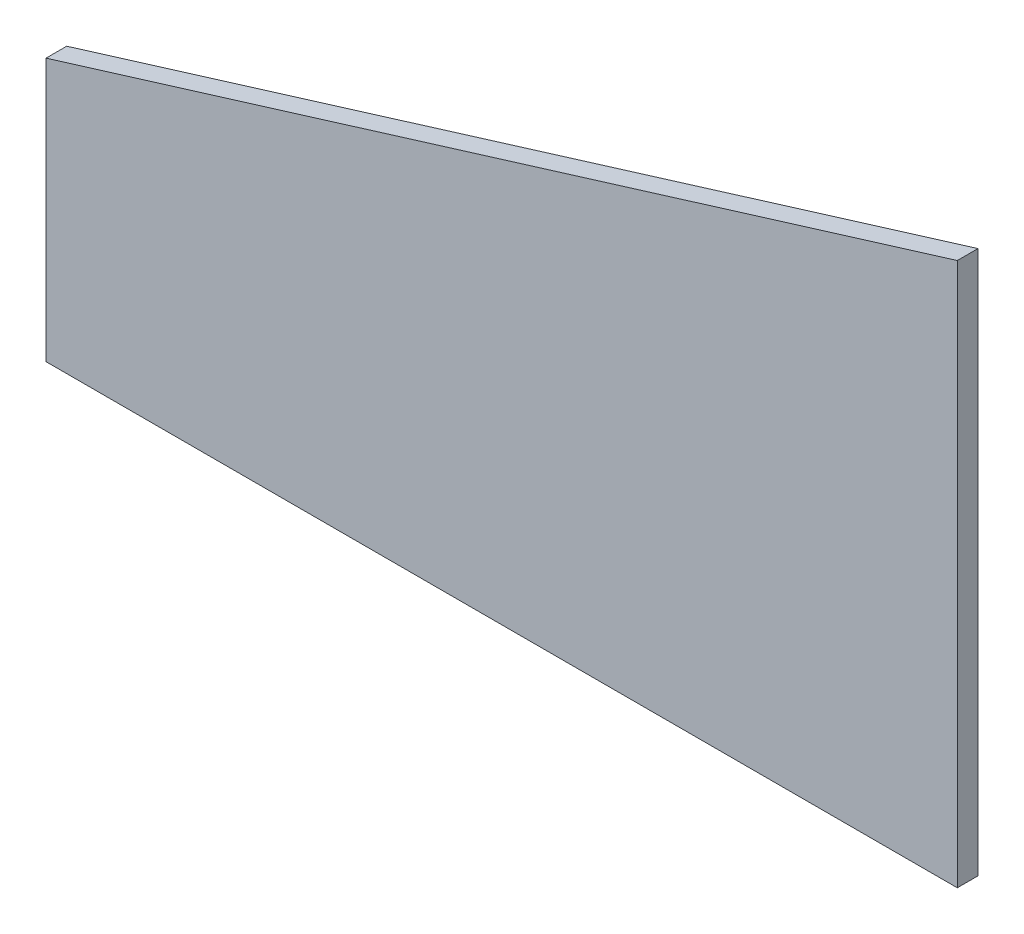
ISO-10303-21;
HEADER;
FILE_DESCRIPTION(('STEP AP214'),'2;1');
FILE_NAME('part.step','',(''),(''),'','','');
FILE_SCHEMA(('AUTOMOTIVE_DESIGN { 1 0 10303 214 1 1 1 1 }'));
ENDSEC;
DATA;
#1=APPLICATION_CONTEXT('core data for automotive mechanical design processes');
#2=APPLICATION_PROTOCOL_DEFINITION('international standard','automotive_design',2000,#1);
#3=PRODUCT_CONTEXT('',#1,'mechanical');
#4=PRODUCT('Part','Part','',(#3));
#5=PRODUCT_RELATED_PRODUCT_CATEGORY('part','',(#4));
#6=PRODUCT_DEFINITION_FORMATION('','',#4);
#7=PRODUCT_DEFINITION_CONTEXT('part definition',#1,'design');
#8=PRODUCT_DEFINITION('design','',#6,#7);
#9=PRODUCT_DEFINITION_SHAPE('','',#8);
#10=(LENGTH_UNIT() NAMED_UNIT(*) SI_UNIT(.MILLI.,.METRE.));
#11=(NAMED_UNIT(*) PLANE_ANGLE_UNIT() SI_UNIT($,.RADIAN.));
#12=(NAMED_UNIT(*) SI_UNIT($,.STERADIAN.) SOLID_ANGLE_UNIT());
#13=UNCERTAINTY_MEASURE_WITH_UNIT(LENGTH_MEASURE(1.E-05),#10,'distance_accuracy_value','');
#14=(GEOMETRIC_REPRESENTATION_CONTEXT(3) GLOBAL_UNCERTAINTY_ASSIGNED_CONTEXT((#13)) GLOBAL_UNIT_ASSIGNED_CONTEXT((#10,
#11,#12)) REPRESENTATION_CONTEXT('',''));
#15=CARTESIAN_POINT('',(0.,0.,0.));
#16=DIRECTION('',(0.,0.,1.));
#17=DIRECTION('',(1.,0.,0.));
#18=AXIS2_PLACEMENT_3D('',#15,#16,#17);
#19=CARTESIAN_POINT('',(308.525680516899,644.154472161342,3.));
#20=DIRECTION('',(0.,1.,0.));
#21=DIRECTION('',(0.,0.,1.));
#22=AXIS2_PLACEMENT_3D('',#19,#20,#21);
#23=PLANE('',#22);
#24=DIRECTION('',(1.,0.,0.));
#25=VECTOR('',#24,1.);
#26=CARTESIAN_POINT('',(308.525680516899,644.154472161342,0.));
#27=LINE('',#26,#25);
#28=CARTESIAN_POINT('',(176.445680516899,644.154472161342,0.));
#29=VERTEX_POINT('',#28);
#30=CARTESIAN_POINT('',(308.525680516899,644.154472161342,0.));
#31=VERTEX_POINT('',#30);
#32=EDGE_CURVE('E104',#29,#31,#27,.T.);
#33=ORIENTED_EDGE('',*,*,#32,.T.);
#34=DIRECTION('',(0.,0.,-1.));
#35=VECTOR('',#34,1.);
#36=CARTESIAN_POINT('',(308.525680516899,644.154472161342,3.));
#37=LINE('',#36,#35);
#38=CARTESIAN_POINT('',(308.525680516899,644.154472161342,3.));
#39=VERTEX_POINT('',#38);
#40=EDGE_CURVE('E11',#39,#31,#37,.T.);
#41=ORIENTED_EDGE('',*,*,#40,.F.);
#42=DIRECTION('',(1.,0.,0.));
#43=VECTOR('',#42,1.);
#44=CARTESIAN_POINT('',(308.525680516899,644.154472161342,3.));
#45=LINE('',#44,#43);
#46=CARTESIAN_POINT('',(176.445680516899,644.154472161342,3.));
#47=VERTEX_POINT('',#46);
#48=EDGE_CURVE('E92',#47,#39,#45,.T.);
#49=ORIENTED_EDGE('',*,*,#48,.F.);
#50=DIRECTION('',(0.,0.,-1.));
#51=VECTOR('',#50,1.);
#52=CARTESIAN_POINT('',(176.445680516899,644.154472161342,3.));
#53=LINE('',#52,#51);
#54=EDGE_CURVE('E100',#47,#29,#53,.T.);
#55=ORIENTED_EDGE('',*,*,#54,.T.);
#56=EDGE_LOOP('',(#33,#41,#49,#55));
#57=FACE_BOUND('',#56,.T.);
#58=ADVANCED_FACE('F41',(#57),#23,.F.);
#59=CARTESIAN_POINT('',(308.525680516899,644.154472161342,3.));
#60=DIRECTION('',(-1.,0.,0.));
#61=DIRECTION('',(0.,0.,1.));
#62=AXIS2_PLACEMENT_3D('',#59,#60,#61);
#63=PLANE('',#62);
#64=DIRECTION('',(0.,1.,0.));
#65=VECTOR('',#64,1.);
#66=CARTESIAN_POINT('',(308.525680516899,644.154472161342,0.));
#67=LINE('',#66,#65);
#68=CARTESIAN_POINT('',(308.525680516899,722.894472161342,0.));
#69=VERTEX_POINT('',#68);
#70=EDGE_CURVE('E96',#31,#69,#67,.T.);
#71=ORIENTED_EDGE('',*,*,#70,.T.);
#72=DIRECTION('',(0.,0.,-1.));
#73=VECTOR('',#72,1.);
#74=CARTESIAN_POINT('',(308.525680516899,722.894472161342,3.));
#75=LINE('',#74,#73);
#76=CARTESIAN_POINT('',(308.525680516899,722.894472161342,3.));
#77=VERTEX_POINT('',#76);
#78=EDGE_CURVE('E49',#77,#69,#75,.T.);
#79=ORIENTED_EDGE('',*,*,#78,.F.);
#80=DIRECTION('',(0.,1.,0.));
#81=VECTOR('',#80,1.);
#82=CARTESIAN_POINT('',(308.525680516899,644.154472161342,3.));
#83=LINE('',#82,#81);
#84=EDGE_CURVE('E87',#39,#77,#83,.T.);
#85=ORIENTED_EDGE('',*,*,#84,.F.);
#86=ORIENTED_EDGE('',*,*,#40,.T.);
#87=EDGE_LOOP('',(#71,#79,#85,#86));
#88=FACE_BOUND('',#87,.T.);
#89=ADVANCED_FACE('F95',(#88),#63,.F.);
#90=CARTESIAN_POINT('',(176.445680516899,682.254472161342,3.));
#91=DIRECTION('',(0.29408584883752,-0.955779008721951,0.));
#92=DIRECTION('',(0.955779008721951,0.29408584883752,0.));
#93=AXIS2_PLACEMENT_3D('',#90,#91,#92);
#94=PLANE('',#93);
#95=DIRECTION('',(-0.955779008721951,-0.29408584883752,0.));
#96=VECTOR('',#95,1.);
#97=CARTESIAN_POINT('',(176.445680516899,682.254472161342,0.));
#98=LINE('',#97,#96);
#99=CARTESIAN_POINT('',(176.445680516899,682.254472161342,0.));
#100=VERTEX_POINT('',#99);
#101=EDGE_CURVE('E74',#69,#100,#98,.T.);
#102=ORIENTED_EDGE('',*,*,#101,.T.);
#103=DIRECTION('',(0.,0.,-1.));
#104=VECTOR('',#103,1.);
#105=CARTESIAN_POINT('',(176.445680516899,682.254472161342,3.));
#106=LINE('',#105,#104);
#107=CARTESIAN_POINT('',(176.445680516899,682.254472161342,3.));
#108=VERTEX_POINT('',#107);
#109=EDGE_CURVE('E97',#108,#100,#106,.T.);
#110=ORIENTED_EDGE('',*,*,#109,.F.);
#111=DIRECTION('',(-0.955779008721951,-0.29408584883752,0.));
#112=VECTOR('',#111,1.);
#113=CARTESIAN_POINT('',(176.445680516899,682.254472161342,3.));
#114=LINE('',#113,#112);
#115=EDGE_CURVE('E90',#77,#108,#114,.T.);
#116=ORIENTED_EDGE('',*,*,#115,.F.);
#117=ORIENTED_EDGE('',*,*,#78,.T.);
#118=EDGE_LOOP('',(#102,#110,#116,#117));
#119=FACE_BOUND('',#118,.T.);
#120=ADVANCED_FACE('F98',(#119),#94,.F.);
#121=CARTESIAN_POINT('',(176.445680516899,644.154472161342,3.));
#122=DIRECTION('',(1.,0.,0.));
#123=DIRECTION('',(0.,0.,-1.));
#124=AXIS2_PLACEMENT_3D('',#121,#122,#123);
#125=PLANE('',#124);
#126=DIRECTION('',(0.,-1.,0.));
#127=VECTOR('',#126,1.);
#128=CARTESIAN_POINT('',(176.445680516899,644.154472161342,0.));
#129=LINE('',#128,#127);
#130=EDGE_CURVE('E80',#100,#29,#129,.T.);
#131=ORIENTED_EDGE('',*,*,#130,.T.);
#132=ORIENTED_EDGE('',*,*,#54,.F.);
#133=DIRECTION('',(0.,-1.,0.));
#134=VECTOR('',#133,1.);
#135=CARTESIAN_POINT('',(176.445680516899,644.154472161342,3.));
#136=LINE('',#135,#134);
#137=EDGE_CURVE('E57',#108,#47,#136,.T.);
#138=ORIENTED_EDGE('',*,*,#137,.F.);
#139=ORIENTED_EDGE('',*,*,#109,.T.);
#140=EDGE_LOOP('',(#131,#132,#138,#139));
#141=FACE_BOUND('',#140,.T.);
#142=ADVANCED_FACE('F111',(#141),#125,.F.);
#143=CARTESIAN_POINT('',(0.,0.,3.));
#144=DIRECTION('',(0.,0.,-1.));
#145=DIRECTION('',(-1.,0.,0.));
#146=AXIS2_PLACEMENT_3D('',#143,#144,#145);
#147=PLANE('',#146);
#148=ORIENTED_EDGE('',*,*,#48,.T.);
#149=ORIENTED_EDGE('',*,*,#84,.T.);
#150=ORIENTED_EDGE('',*,*,#115,.T.);
#151=ORIENTED_EDGE('',*,*,#137,.T.);
#152=EDGE_LOOP('',(#148,#149,#150,#151));
#153=FACE_BOUND('',#152,.T.);
#154=ADVANCED_FACE('F88',(#153),#147,.F.);
#155=CARTESIAN_POINT('',(0.,0.,0.));
#156=DIRECTION('',(0.,0.,-1.));
#157=DIRECTION('',(-1.,0.,0.));
#158=AXIS2_PLACEMENT_3D('',#155,#156,#157);
#159=PLANE('',#158);
#160=ORIENTED_EDGE('',*,*,#32,.F.);
#161=ORIENTED_EDGE('',*,*,#130,.F.);
#162=ORIENTED_EDGE('',*,*,#101,.F.);
#163=ORIENTED_EDGE('',*,*,#70,.F.);
#164=EDGE_LOOP('',(#160,#161,#162,#163));
#165=FACE_BOUND('',#164,.T.);
#166=ADVANCED_FACE('F114',(#165),#159,.T.);
#167=CLOSED_SHELL('',(#58,#89,#120,#142,#154,#166));
#168=MANIFOLD_SOLID_BREP('B2',#167);
#169=ADVANCED_BREP_SHAPE_REPRESENTATION('',(#18,#168),#14);
#170=SHAPE_DEFINITION_REPRESENTATION(#9,#169);
ENDSEC;
END-ISO-10303-21;
